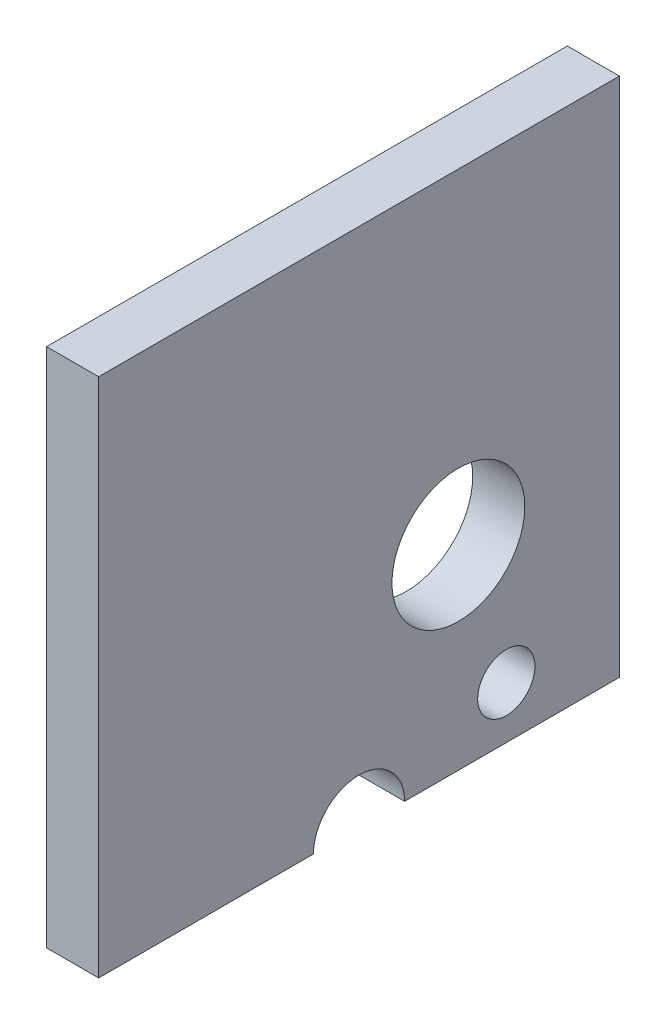
ISO-10303-21;
HEADER;
FILE_DESCRIPTION(('STEP AP214'),'2;1');
FILE_NAME('part.step','',(''),(''),'','','');
FILE_SCHEMA(('AUTOMOTIVE_DESIGN { 1 0 10303 214 1 1 1 1 }'));
ENDSEC;
DATA;
#1=APPLICATION_CONTEXT('core data for automotive mechanical design processes');
#2=APPLICATION_PROTOCOL_DEFINITION('international standard','automotive_design',2000,#1);
#3=PRODUCT_CONTEXT('',#1,'mechanical');
#4=PRODUCT('Part','Part','',(#3));
#5=PRODUCT_RELATED_PRODUCT_CATEGORY('part','',(#4));
#6=PRODUCT_DEFINITION_FORMATION('','',#4);
#7=PRODUCT_DEFINITION_CONTEXT('part definition',#1,'design');
#8=PRODUCT_DEFINITION('design','',#6,#7);
#9=PRODUCT_DEFINITION_SHAPE('','',#8);
#10=(LENGTH_UNIT() NAMED_UNIT(*) SI_UNIT(.MILLI.,.METRE.));
#11=(NAMED_UNIT(*) PLANE_ANGLE_UNIT() SI_UNIT($,.RADIAN.));
#12=(NAMED_UNIT(*) SI_UNIT($,.STERADIAN.) SOLID_ANGLE_UNIT());
#13=UNCERTAINTY_MEASURE_WITH_UNIT(LENGTH_MEASURE(1.E-05),#10,'distance_accuracy_value','');
#14=(GEOMETRIC_REPRESENTATION_CONTEXT(3) GLOBAL_UNCERTAINTY_ASSIGNED_CONTEXT((#13)) GLOBAL_UNIT_ASSIGNED_CONTEXT((#10,
#11,#12)) REPRESENTATION_CONTEXT('',''));
#15=CARTESIAN_POINT('',(0.,0.,0.));
#16=DIRECTION('',(0.,0.,1.));
#17=DIRECTION('',(1.,0.,0.));
#18=AXIS2_PLACEMENT_3D('',#15,#16,#17);
#19=CARTESIAN_POINT('',(2.,-20.,-10.));
#20=DIRECTION('',(-1.,0.,0.));
#21=DIRECTION('',(0.,0.,1.));
#22=AXIS2_PLACEMENT_3D('',#19,#20,#21);
#23=CYLINDRICAL_SURFACE('',#22,1.75);
#24=CARTESIAN_POINT('',(0.,-20.,-10.));
#25=DIRECTION('',(1.,0.,0.));
#26=DIRECTION('',(0.,0.,-1.));
#27=AXIS2_PLACEMENT_3D('',#24,#25,#26);
#28=CIRCLE('',#27,1.75);
#29=CARTESIAN_POINT('',(0.,-20.,-11.75));
#30=VERTEX_POINT('',#29);
#31=CARTESIAN_POINT('',(0.,-20.,-8.25));
#32=VERTEX_POINT('',#31);
#33=EDGE_CURVE('E122',#30,#32,#28,.T.);
#34=ORIENTED_EDGE('',*,*,#33,.F.);
#35=DIRECTION('',(-1.,0.,0.));
#36=VECTOR('',#35,1.);
#37=CARTESIAN_POINT('',(2.,-20.,-11.75));
#38=LINE('',#37,#36);
#39=CARTESIAN_POINT('',(2.,-20.,-11.75));
#40=VERTEX_POINT('',#39);
#41=EDGE_CURVE('E11',#40,#30,#38,.T.);
#42=ORIENTED_EDGE('',*,*,#41,.F.);
#43=CARTESIAN_POINT('',(2.,-20.,-10.));
#44=DIRECTION('',(1.,0.,0.));
#45=DIRECTION('',(0.,0.,-1.));
#46=AXIS2_PLACEMENT_3D('',#43,#44,#45);
#47=CIRCLE('',#46,1.75);
#48=CARTESIAN_POINT('',(2.,-20.,-8.25));
#49=VERTEX_POINT('',#48);
#50=EDGE_CURVE('E148',#40,#49,#47,.T.);
#51=ORIENTED_EDGE('',*,*,#50,.T.);
#52=DIRECTION('',(-1.,0.,0.));
#53=VECTOR('',#52,1.);
#54=CARTESIAN_POINT('',(2.,-20.,-8.25));
#55=LINE('',#54,#53);
#56=EDGE_CURVE('E85',#49,#32,#55,.T.);
#57=ORIENTED_EDGE('',*,*,#56,.T.);
#58=EDGE_LOOP('',(#34,#42,#51,#57));
#59=FACE_BOUND('',#58,.T.);
#60=ADVANCED_FACE('F41',(#59),#23,.F.);
#61=CARTESIAN_POINT('',(2.,-20.,0.));
#62=DIRECTION('',(0.,1.,0.));
#63=DIRECTION('',(0.,0.,1.));
#64=AXIS2_PLACEMENT_3D('',#61,#62,#63);
#65=PLANE('',#64);
#66=DIRECTION('',(0.,0.,-1.));
#67=VECTOR('',#66,1.);
#68=CARTESIAN_POINT('',(0.,-20.,0.));
#69=LINE('',#68,#67);
#70=CARTESIAN_POINT('',(0.,-20.,-20.));
#71=VERTEX_POINT('',#70);
#72=EDGE_CURVE('E125',#30,#71,#69,.T.);
#73=ORIENTED_EDGE('',*,*,#72,.T.);
#74=DIRECTION('',(-1.,0.,0.));
#75=VECTOR('',#74,1.);
#76=CARTESIAN_POINT('',(2.,-20.,-20.));
#77=LINE('',#76,#75);
#78=CARTESIAN_POINT('',(2.,-20.,-20.));
#79=VERTEX_POINT('',#78);
#80=EDGE_CURVE('E49',#79,#71,#77,.T.);
#81=ORIENTED_EDGE('',*,*,#80,.F.);
#82=DIRECTION('',(0.,0.,-1.));
#83=VECTOR('',#82,1.);
#84=CARTESIAN_POINT('',(2.,-20.,0.));
#85=LINE('',#84,#83);
#86=EDGE_CURVE('E118',#40,#79,#85,.T.);
#87=ORIENTED_EDGE('',*,*,#86,.F.);
#88=ORIENTED_EDGE('',*,*,#41,.T.);
#89=EDGE_LOOP('',(#73,#81,#87,#88));
#90=FACE_BOUND('',#89,.T.);
#91=ADVANCED_FACE('F143',(#90),#65,.F.);
#92=CARTESIAN_POINT('',(2.,0.,-20.));
#93=DIRECTION('',(0.,0.,-1.));
#94=DIRECTION('',(0.,1.,0.));
#95=AXIS2_PLACEMENT_3D('',#92,#93,#94);
#96=PLANE('',#95);
#97=DIRECTION('',(0.,-1.,0.));
#98=VECTOR('',#97,1.);
#99=CARTESIAN_POINT('',(0.,0.,-20.));
#100=LINE('',#99,#98);
#101=CARTESIAN_POINT('',(0.,0.,-20.));
#102=VERTEX_POINT('',#101);
#103=EDGE_CURVE('E129',#102,#71,#100,.T.);
#104=ORIENTED_EDGE('',*,*,#103,.F.);
#105=DIRECTION('',(-1.,0.,0.));
#106=VECTOR('',#105,1.);
#107=CARTESIAN_POINT('',(2.,0.,-20.));
#108=LINE('',#107,#106);
#109=CARTESIAN_POINT('',(2.,0.,-20.));
#110=VERTEX_POINT('',#109);
#111=EDGE_CURVE('E107',#110,#102,#108,.T.);
#112=ORIENTED_EDGE('',*,*,#111,.F.);
#113=DIRECTION('',(0.,-1.,0.));
#114=VECTOR('',#113,1.);
#115=CARTESIAN_POINT('',(2.,0.,-20.));
#116=LINE('',#115,#114);
#117=EDGE_CURVE('E116',#110,#79,#116,.T.);
#118=ORIENTED_EDGE('',*,*,#117,.T.);
#119=ORIENTED_EDGE('',*,*,#80,.T.);
#120=EDGE_LOOP('',(#104,#112,#118,#119));
#121=FACE_BOUND('',#120,.T.);
#122=ADVANCED_FACE('F140',(#121),#96,.T.);
#123=CARTESIAN_POINT('',(2.,0.,0.));
#124=DIRECTION('',(0.,1.,0.));
#125=DIRECTION('',(0.,0.,1.));
#126=AXIS2_PLACEMENT_3D('',#123,#124,#125);
#127=PLANE('',#126);
#128=DIRECTION('',(0.,0.,-1.));
#129=VECTOR('',#128,1.);
#130=CARTESIAN_POINT('',(0.,0.,0.));
#131=LINE('',#130,#129);
#132=CARTESIAN_POINT('',(0.,0.,0.));
#133=VERTEX_POINT('',#132);
#134=EDGE_CURVE('E106',#133,#102,#131,.T.);
#135=ORIENTED_EDGE('',*,*,#134,.F.);
#136=DIRECTION('',(-1.,0.,0.));
#137=VECTOR('',#136,1.);
#138=CARTESIAN_POINT('',(2.,0.,0.));
#139=LINE('',#138,#137);
#140=CARTESIAN_POINT('',(2.,0.,0.));
#141=VERTEX_POINT('',#140);
#142=EDGE_CURVE('E100',#141,#133,#139,.T.);
#143=ORIENTED_EDGE('',*,*,#142,.F.);
#144=DIRECTION('',(0.,0.,-1.));
#145=VECTOR('',#144,1.);
#146=CARTESIAN_POINT('',(2.,0.,0.));
#147=LINE('',#146,#145);
#148=EDGE_CURVE('E104',#141,#110,#147,.T.);
#149=ORIENTED_EDGE('',*,*,#148,.T.);
#150=ORIENTED_EDGE('',*,*,#111,.T.);
#151=EDGE_LOOP('',(#135,#143,#149,#150));
#152=FACE_BOUND('',#151,.T.);
#153=ADVANCED_FACE('F102',(#152),#127,.T.);
#154=CARTESIAN_POINT('',(2.,0.,0.));
#155=DIRECTION('',(0.,0.,-1.));
#156=DIRECTION('',(0.,1.,0.));
#157=AXIS2_PLACEMENT_3D('',#154,#155,#156);
#158=PLANE('',#157);
#159=DIRECTION('',(0.,-1.,0.));
#160=VECTOR('',#159,1.);
#161=CARTESIAN_POINT('',(0.,0.,0.));
#162=LINE('',#161,#160);
#163=CARTESIAN_POINT('',(0.,-20.,0.));
#164=VERTEX_POINT('',#163);
#165=EDGE_CURVE('E78',#133,#164,#162,.T.);
#166=ORIENTED_EDGE('',*,*,#165,.T.);
#167=DIRECTION('',(-1.,0.,0.));
#168=VECTOR('',#167,1.);
#169=CARTESIAN_POINT('',(2.,-20.,0.));
#170=LINE('',#169,#168);
#171=CARTESIAN_POINT('',(2.,-20.,0.));
#172=VERTEX_POINT('',#171);
#173=EDGE_CURVE('E108',#172,#164,#170,.T.);
#174=ORIENTED_EDGE('',*,*,#173,.F.);
#175=DIRECTION('',(0.,-1.,0.));
#176=VECTOR('',#175,1.);
#177=CARTESIAN_POINT('',(2.,0.,0.));
#178=LINE('',#177,#176);
#179=EDGE_CURVE('E110',#141,#172,#178,.T.);
#180=ORIENTED_EDGE('',*,*,#179,.F.);
#181=ORIENTED_EDGE('',*,*,#142,.T.);
#182=EDGE_LOOP('',(#166,#174,#180,#181));
#183=FACE_BOUND('',#182,.T.);
#184=ADVANCED_FACE('F111',(#183),#158,.F.);
#185=EDGE_CURVE('E130',#164,#32,#69,.T.);
#186=ORIENTED_EDGE('',*,*,#185,.T.);
#187=ORIENTED_EDGE('',*,*,#56,.F.);
#188=EDGE_CURVE('E57',#172,#49,#85,.T.);
#189=ORIENTED_EDGE('',*,*,#188,.F.);
#190=ORIENTED_EDGE('',*,*,#173,.T.);
#191=EDGE_LOOP('',(#186,#187,#189,#190));
#192=FACE_BOUND('',#191,.T.);
#193=ADVANCED_FACE('F174',(#192),#65,.F.);
#194=CARTESIAN_POINT('',(2.,0.,0.));
#195=DIRECTION('',(1.,0.,0.));
#196=DIRECTION('',(0.,0.,-1.));
#197=AXIS2_PLACEMENT_3D('',#194,#195,#196);
#198=PLANE('',#197);
#199=CARTESIAN_POINT('',(2.,-18.,-15.6568542494924));
#200=DIRECTION('',(1.,0.,0.));
#201=DIRECTION('',(0.,0.,-1.));
#202=AXIS2_PLACEMENT_3D('',#199,#200,#201);
#203=CIRCLE('',#202,1.1);
#204=CARTESIAN_POINT('',(2.,-18.,-16.7568542494924));
#205=VERTEX_POINT('',#204);
#206=EDGE_CURVE('E157',#205,#205,#203,.T.);
#207=ORIENTED_EDGE('',*,*,#206,.F.);
#208=EDGE_LOOP('',(#207));
#209=FACE_BOUND('',#208,.T.);
#210=CARTESIAN_POINT('',(2.,-12.5,-13.8156589855402));
#211=DIRECTION('',(1.,0.,0.));
#212=DIRECTION('',(0.,0.,-1.));
#213=AXIS2_PLACEMENT_3D('',#210,#211,#212);
#214=CIRCLE('',#213,2.55);
#215=CARTESIAN_POINT('',(2.,-12.5,-16.3656589855402));
#216=VERTEX_POINT('',#215);
#217=EDGE_CURVE('E154',#216,#216,#214,.T.);
#218=ORIENTED_EDGE('',*,*,#217,.F.);
#219=EDGE_LOOP('',(#218));
#220=FACE_BOUND('',#219,.T.);
#221=ORIENTED_EDGE('',*,*,#50,.F.);
#222=ORIENTED_EDGE('',*,*,#86,.T.);
#223=ORIENTED_EDGE('',*,*,#117,.F.);
#224=ORIENTED_EDGE('',*,*,#148,.F.);
#225=ORIENTED_EDGE('',*,*,#179,.T.);
#226=ORIENTED_EDGE('',*,*,#188,.T.);
#227=EDGE_LOOP('',(#221,#222,#223,#224,#225,#226));
#228=FACE_BOUND('',#227,.T.);
#229=ADVANCED_FACE('F114',(#209,#220,#228),#198,.T.);
#230=CARTESIAN_POINT('',(0.,0.,0.));
#231=DIRECTION('',(1.,0.,0.));
#232=DIRECTION('',(0.,0.,-1.));
#233=AXIS2_PLACEMENT_3D('',#230,#231,#232);
#234=PLANE('',#233);
#235=CARTESIAN_POINT('',(0.,-18.,-15.6568542494924));
#236=DIRECTION('',(1.,0.,0.));
#237=DIRECTION('',(0.,0.,-1.));
#238=AXIS2_PLACEMENT_3D('',#235,#236,#237);
#239=CIRCLE('',#238,1.1);
#240=CARTESIAN_POINT('',(0.,-18.,-16.7568542494924));
#241=VERTEX_POINT('',#240);
#242=EDGE_CURVE('E126',#241,#241,#239,.T.);
#243=ORIENTED_EDGE('',*,*,#242,.T.);
#244=EDGE_LOOP('',(#243));
#245=FACE_BOUND('',#244,.T.);
#246=CARTESIAN_POINT('',(0.,-12.5,-13.8156589855402));
#247=DIRECTION('',(1.,0.,0.));
#248=DIRECTION('',(0.,0.,-1.));
#249=AXIS2_PLACEMENT_3D('',#246,#247,#248);
#250=CIRCLE('',#249,2.55);
#251=CARTESIAN_POINT('',(0.,-12.5,-16.3656589855402));
#252=VERTEX_POINT('',#251);
#253=EDGE_CURVE('E151',#252,#252,#250,.T.);
#254=ORIENTED_EDGE('',*,*,#253,.T.);
#255=EDGE_LOOP('',(#254));
#256=FACE_BOUND('',#255,.T.);
#257=ORIENTED_EDGE('',*,*,#33,.T.);
#258=ORIENTED_EDGE('',*,*,#185,.F.);
#259=ORIENTED_EDGE('',*,*,#165,.F.);
#260=ORIENTED_EDGE('',*,*,#134,.T.);
#261=ORIENTED_EDGE('',*,*,#103,.T.);
#262=ORIENTED_EDGE('',*,*,#72,.F.);
#263=EDGE_LOOP('',(#257,#258,#259,#260,#261,#262));
#264=FACE_BOUND('',#263,.T.);
#265=ADVANCED_FACE('F145',(#245,#256,#264),#234,.F.);
#266=CARTESIAN_POINT('',(0.,-12.5,-13.8156589855402));
#267=DIRECTION('',(1.,0.,0.));
#268=DIRECTION('',(0.,0.,-1.));
#269=AXIS2_PLACEMENT_3D('',#266,#267,#268);
#270=CYLINDRICAL_SURFACE('',#269,2.55);
#271=ORIENTED_EDGE('',*,*,#253,.F.);
#272=EDGE_LOOP('',(#271));
#273=FACE_BOUND('',#272,.T.);
#274=ORIENTED_EDGE('',*,*,#217,.T.);
#275=EDGE_LOOP('',(#274));
#276=FACE_BOUND('',#275,.T.);
#277=ADVANCED_FACE('F168',(#273,#276),#270,.F.);
#278=CARTESIAN_POINT('',(0.,-18.,-15.6568542494924));
#279=DIRECTION('',(1.,0.,0.));
#280=DIRECTION('',(0.,0.,-1.));
#281=AXIS2_PLACEMENT_3D('',#278,#279,#280);
#282=CYLINDRICAL_SURFACE('',#281,1.1);
#283=ORIENTED_EDGE('',*,*,#242,.F.);
#284=EDGE_LOOP('',(#283));
#285=FACE_BOUND('',#284,.T.);
#286=ORIENTED_EDGE('',*,*,#206,.T.);
#287=EDGE_LOOP('',(#286));
#288=FACE_BOUND('',#287,.T.);
#289=ADVANCED_FACE('F165',(#285,#288),#282,.F.);
#290=CLOSED_SHELL('',(#60,#91,#122,#153,#184,#193,#229,#265,#277,#289));
#291=MANIFOLD_SOLID_BREP('B2',#290);
#292=ADVANCED_BREP_SHAPE_REPRESENTATION('',(#18,#291),#14);
#293=SHAPE_DEFINITION_REPRESENTATION(#9,#292);
ENDSEC;
END-ISO-10303-21;
